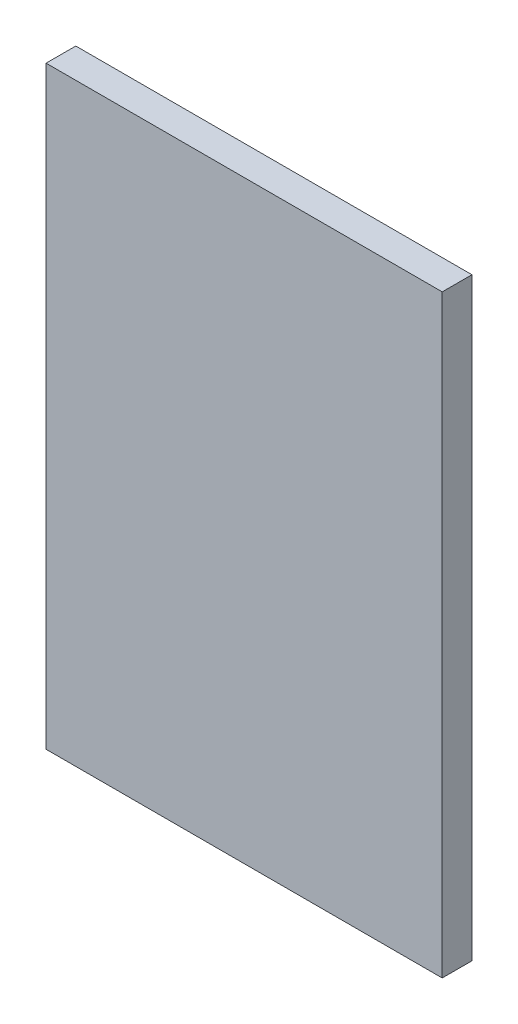
ISO-10303-21;
HEADER;
FILE_DESCRIPTION(('STEP AP214'),'2;1');
FILE_NAME('part.step','',(''),(''),'','','');
FILE_SCHEMA(('AUTOMOTIVE_DESIGN { 1 0 10303 214 1 1 1 1 }'));
ENDSEC;
DATA;
#1=APPLICATION_CONTEXT('core data for automotive mechanical design processes');
#2=APPLICATION_PROTOCOL_DEFINITION('international standard','automotive_design',2000,#1);
#3=PRODUCT_CONTEXT('',#1,'mechanical');
#4=PRODUCT('Part','Part','',(#3));
#5=PRODUCT_RELATED_PRODUCT_CATEGORY('part','',(#4));
#6=PRODUCT_DEFINITION_FORMATION('','',#4);
#7=PRODUCT_DEFINITION_CONTEXT('part definition',#1,'design');
#8=PRODUCT_DEFINITION('design','',#6,#7);
#9=PRODUCT_DEFINITION_SHAPE('','',#8);
#10=(LENGTH_UNIT() NAMED_UNIT(*) SI_UNIT(.MILLI.,.METRE.));
#11=(NAMED_UNIT(*) PLANE_ANGLE_UNIT() SI_UNIT($,.RADIAN.));
#12=(NAMED_UNIT(*) SI_UNIT($,.STERADIAN.) SOLID_ANGLE_UNIT());
#13=UNCERTAINTY_MEASURE_WITH_UNIT(LENGTH_MEASURE(1.E-05),#10,'distance_accuracy_value','');
#14=(GEOMETRIC_REPRESENTATION_CONTEXT(3) GLOBAL_UNCERTAINTY_ASSIGNED_CONTEXT((#13)) GLOBAL_UNIT_ASSIGNED_CONTEXT((#10,
#11,#12)) REPRESENTATION_CONTEXT('',''));
#15=CARTESIAN_POINT('',(0.,0.,0.));
#16=DIRECTION('',(0.,0.,1.));
#17=DIRECTION('',(1.,0.,0.));
#18=AXIS2_PLACEMENT_3D('',#15,#16,#17);
#19=CARTESIAN_POINT('',(40.,0.,3.));
#20=DIRECTION('',(0.,1.,0.));
#21=DIRECTION('',(-1.,0.,0.));
#22=AXIS2_PLACEMENT_3D('',#19,#20,#21);
#23=PLANE('',#22);
#24=DIRECTION('',(1.,0.,0.));
#25=VECTOR('',#24,1.);
#26=CARTESIAN_POINT('',(40.,0.,0.));
#27=LINE('',#26,#25);
#28=CARTESIAN_POINT('',(0.,0.,0.));
#29=VERTEX_POINT('',#28);
#30=CARTESIAN_POINT('',(40.,0.,0.));
#31=VERTEX_POINT('',#30);
#32=EDGE_CURVE('E96',#29,#31,#27,.T.);
#33=ORIENTED_EDGE('',*,*,#32,.T.);
#34=DIRECTION('',(0.,0.,-1.));
#35=VECTOR('',#34,1.);
#36=CARTESIAN_POINT('',(40.,0.,3.));
#37=LINE('',#36,#35);
#38=CARTESIAN_POINT('',(40.,0.,3.));
#39=VERTEX_POINT('',#38);
#40=EDGE_CURVE('E11',#39,#31,#37,.T.);
#41=ORIENTED_EDGE('',*,*,#40,.F.);
#42=DIRECTION('',(1.,0.,0.));
#43=VECTOR('',#42,1.);
#44=CARTESIAN_POINT('',(40.,0.,3.));
#45=LINE('',#44,#43);
#46=CARTESIAN_POINT('',(0.,0.,3.));
#47=VERTEX_POINT('',#46);
#48=EDGE_CURVE('E84',#47,#39,#45,.T.);
#49=ORIENTED_EDGE('',*,*,#48,.F.);
#50=DIRECTION('',(0.,0.,-1.));
#51=VECTOR('',#50,1.);
#52=CARTESIAN_POINT('',(0.,0.,3.));
#53=LINE('',#52,#51);
#54=EDGE_CURVE('E92',#47,#29,#53,.T.);
#55=ORIENTED_EDGE('',*,*,#54,.T.);
#56=EDGE_LOOP('',(#33,#41,#49,#55));
#57=FACE_BOUND('',#56,.T.);
#58=ADVANCED_FACE('F33',(#57),#23,.F.);
#59=CARTESIAN_POINT('',(40.,60.,3.));
#60=DIRECTION('',(-1.,0.,0.));
#61=DIRECTION('',(0.,-1.,0.));
#62=AXIS2_PLACEMENT_3D('',#59,#60,#61);
#63=PLANE('',#62);
#64=DIRECTION('',(0.,1.,0.));
#65=VECTOR('',#64,1.);
#66=CARTESIAN_POINT('',(40.,60.,0.));
#67=LINE('',#66,#65);
#68=CARTESIAN_POINT('',(40.,60.,0.));
#69=VERTEX_POINT('',#68);
#70=EDGE_CURVE('E88',#31,#69,#67,.T.);
#71=ORIENTED_EDGE('',*,*,#70,.T.);
#72=DIRECTION('',(0.,0.,-1.));
#73=VECTOR('',#72,1.);
#74=CARTESIAN_POINT('',(40.,60.,3.));
#75=LINE('',#74,#73);
#76=CARTESIAN_POINT('',(40.,60.,3.));
#77=VERTEX_POINT('',#76);
#78=EDGE_CURVE('E41',#77,#69,#75,.T.);
#79=ORIENTED_EDGE('',*,*,#78,.F.);
#80=DIRECTION('',(0.,1.,0.));
#81=VECTOR('',#80,1.);
#82=CARTESIAN_POINT('',(40.,60.,3.));
#83=LINE('',#82,#81);
#84=EDGE_CURVE('E79',#39,#77,#83,.T.);
#85=ORIENTED_EDGE('',*,*,#84,.F.);
#86=ORIENTED_EDGE('',*,*,#40,.T.);
#87=EDGE_LOOP('',(#71,#79,#85,#86));
#88=FACE_BOUND('',#87,.T.);
#89=ADVANCED_FACE('F87',(#88),#63,.F.);
#90=CARTESIAN_POINT('',(0.,60.,3.));
#91=DIRECTION('',(0.,-1.,0.));
#92=DIRECTION('',(0.,0.,-1.));
#93=AXIS2_PLACEMENT_3D('',#90,#91,#92);
#94=PLANE('',#93);
#95=DIRECTION('',(-1.,0.,0.));
#96=VECTOR('',#95,1.);
#97=CARTESIAN_POINT('',(0.,60.,0.));
#98=LINE('',#97,#96);
#99=CARTESIAN_POINT('',(0.,60.,0.));
#100=VERTEX_POINT('',#99);
#101=EDGE_CURVE('E66',#69,#100,#98,.T.);
#102=ORIENTED_EDGE('',*,*,#101,.T.);
#103=DIRECTION('',(0.,0.,-1.));
#104=VECTOR('',#103,1.);
#105=CARTESIAN_POINT('',(0.,60.,3.));
#106=LINE('',#105,#104);
#107=CARTESIAN_POINT('',(0.,60.,3.));
#108=VERTEX_POINT('',#107);
#109=EDGE_CURVE('E89',#108,#100,#106,.T.);
#110=ORIENTED_EDGE('',*,*,#109,.F.);
#111=DIRECTION('',(-1.,0.,0.));
#112=VECTOR('',#111,1.);
#113=CARTESIAN_POINT('',(0.,60.,3.));
#114=LINE('',#113,#112);
#115=EDGE_CURVE('E82',#77,#108,#114,.T.);
#116=ORIENTED_EDGE('',*,*,#115,.F.);
#117=ORIENTED_EDGE('',*,*,#78,.T.);
#118=EDGE_LOOP('',(#102,#110,#116,#117));
#119=FACE_BOUND('',#118,.T.);
#120=ADVANCED_FACE('F90',(#119),#94,.F.);
#121=CARTESIAN_POINT('',(0.,0.,3.));
#122=DIRECTION('',(1.,0.,0.));
#123=DIRECTION('',(0.,0.,-1.));
#124=AXIS2_PLACEMENT_3D('',#121,#122,#123);
#125=PLANE('',#124);
#126=DIRECTION('',(0.,-1.,0.));
#127=VECTOR('',#126,1.);
#128=CARTESIAN_POINT('',(0.,0.,0.));
#129=LINE('',#128,#127);
#130=EDGE_CURVE('E72',#100,#29,#129,.T.);
#131=ORIENTED_EDGE('',*,*,#130,.T.);
#132=ORIENTED_EDGE('',*,*,#54,.F.);
#133=DIRECTION('',(0.,-1.,0.));
#134=VECTOR('',#133,1.);
#135=CARTESIAN_POINT('',(0.,0.,3.));
#136=LINE('',#135,#134);
#137=EDGE_CURVE('E49',#108,#47,#136,.T.);
#138=ORIENTED_EDGE('',*,*,#137,.F.);
#139=ORIENTED_EDGE('',*,*,#109,.T.);
#140=EDGE_LOOP('',(#131,#132,#138,#139));
#141=FACE_BOUND('',#140,.T.);
#142=ADVANCED_FACE('F103',(#141),#125,.F.);
#143=CARTESIAN_POINT('',(0.,0.,3.));
#144=DIRECTION('',(0.,0.,-1.));
#145=DIRECTION('',(-1.,0.,0.));
#146=AXIS2_PLACEMENT_3D('',#143,#144,#145);
#147=PLANE('',#146);
#148=ORIENTED_EDGE('',*,*,#48,.T.);
#149=ORIENTED_EDGE('',*,*,#84,.T.);
#150=ORIENTED_EDGE('',*,*,#115,.T.);
#151=ORIENTED_EDGE('',*,*,#137,.T.);
#152=EDGE_LOOP('',(#148,#149,#150,#151));
#153=FACE_BOUND('',#152,.T.);
#154=ADVANCED_FACE('F80',(#153),#147,.F.);
#155=CARTESIAN_POINT('',(0.,0.,0.));
#156=DIRECTION('',(0.,0.,-1.));
#157=DIRECTION('',(-1.,0.,0.));
#158=AXIS2_PLACEMENT_3D('',#155,#156,#157);
#159=PLANE('',#158);
#160=ORIENTED_EDGE('',*,*,#32,.F.);
#161=ORIENTED_EDGE('',*,*,#130,.F.);
#162=ORIENTED_EDGE('',*,*,#101,.F.);
#163=ORIENTED_EDGE('',*,*,#70,.F.);
#164=EDGE_LOOP('',(#160,#161,#162,#163));
#165=FACE_BOUND('',#164,.T.);
#166=ADVANCED_FACE('F106',(#165),#159,.T.);
#167=CLOSED_SHELL('',(#58,#89,#120,#142,#154,#166));
#168=MANIFOLD_SOLID_BREP('B2',#167);
#169=ADVANCED_BREP_SHAPE_REPRESENTATION('',(#18,#168),#14);
#170=SHAPE_DEFINITION_REPRESENTATION(#9,#169);
ENDSEC;
END-ISO-10303-21;
